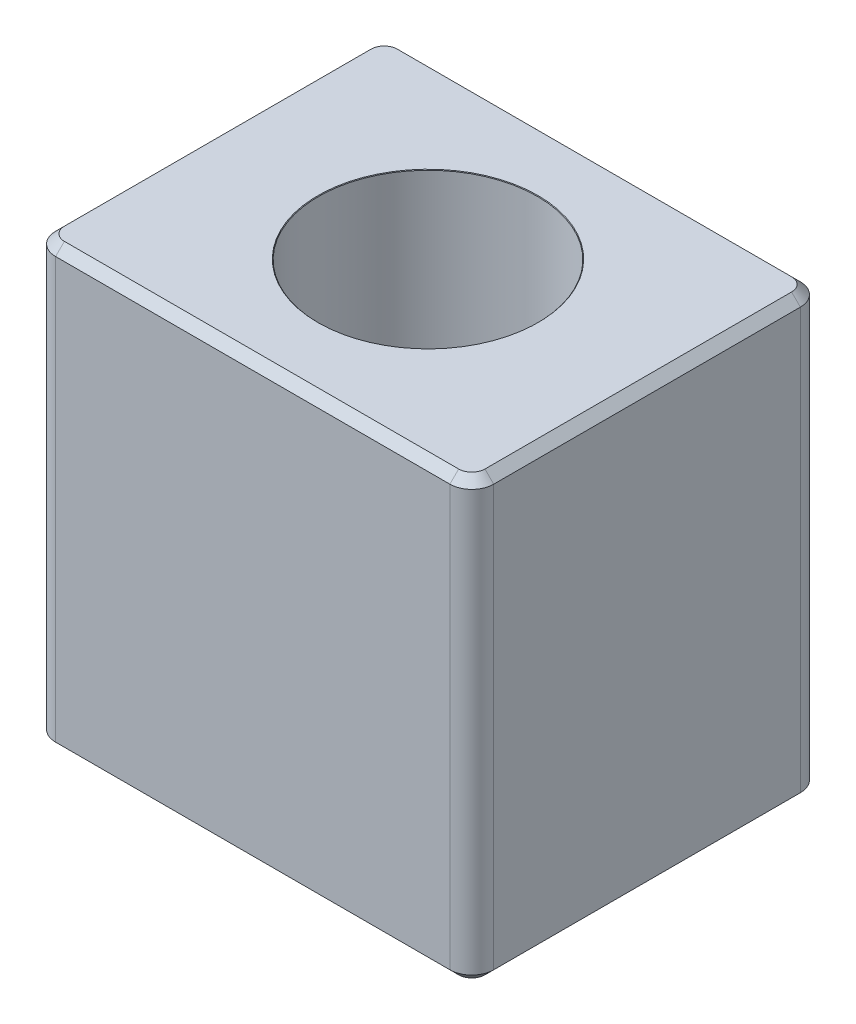
ISO-10303-21;
HEADER;
FILE_DESCRIPTION(('STEP AP214'),'2;1');
FILE_NAME('part.step','',(''),(''),'','','');
FILE_SCHEMA(('AUTOMOTIVE_DESIGN { 1 0 10303 214 1 1 1 1 }'));
ENDSEC;
DATA;
#1=APPLICATION_CONTEXT('core data for automotive mechanical design processes');
#2=APPLICATION_PROTOCOL_DEFINITION('international standard','automotive_design',2000,#1);
#3=PRODUCT_CONTEXT('',#1,'mechanical');
#4=PRODUCT('Part','Part','',(#3));
#5=PRODUCT_RELATED_PRODUCT_CATEGORY('part','',(#4));
#6=PRODUCT_DEFINITION_FORMATION('','',#4);
#7=PRODUCT_DEFINITION_CONTEXT('part definition',#1,'design');
#8=PRODUCT_DEFINITION('design','',#6,#7);
#9=PRODUCT_DEFINITION_SHAPE('','',#8);
#10=(LENGTH_UNIT() NAMED_UNIT(*) SI_UNIT(.MILLI.,.METRE.));
#11=(NAMED_UNIT(*) PLANE_ANGLE_UNIT() SI_UNIT($,.RADIAN.));
#12=(NAMED_UNIT(*) SI_UNIT($,.STERADIAN.) SOLID_ANGLE_UNIT());
#13=UNCERTAINTY_MEASURE_WITH_UNIT(LENGTH_MEASURE(1.E-05),#10,'distance_accuracy_value','');
#14=(GEOMETRIC_REPRESENTATION_CONTEXT(3) GLOBAL_UNCERTAINTY_ASSIGNED_CONTEXT((#13)) GLOBAL_UNIT_ASSIGNED_CONTEXT((#10,
#11,#12)) REPRESENTATION_CONTEXT('',''));
#15=CARTESIAN_POINT('',(0.,0.,0.));
#16=DIRECTION('',(0.,0.,1.));
#17=DIRECTION('',(1.,0.,0.));
#18=AXIS2_PLACEMENT_3D('',#15,#16,#17);
#19=CARTESIAN_POINT('',(-10.,-10.,16.));
#20=DIRECTION('',(1.,0.,0.));
#21=DIRECTION('',(0.,0.,-1.));
#22=AXIS2_PLACEMENT_3D('',#19,#20,#21);
#23=PLANE('',#22);
#24=DIRECTION('',(0.,-1.,0.));
#25=VECTOR('',#24,1.);
#26=CARTESIAN_POINT('',(-10.,10.,15.));
#27=LINE('',#26,#25);
#28=CARTESIAN_POINT('',(-10.,-9.60000000000001,15.));
#29=VERTEX_POINT('',#28);
#30=CARTESIAN_POINT('',(-10.,9.6,15.));
#31=VERTEX_POINT('',#30);
#32=EDGE_CURVE('E309',#29,#31,#27,.F.);
#33=ORIENTED_EDGE('',*,*,#32,.T.);
#34=DIRECTION('',(0.,0.,-1.));
#35=VECTOR('',#34,1.);
#36=CARTESIAN_POINT('',(-10.,9.6,16.));
#37=LINE('',#36,#35);
#38=CARTESIAN_POINT('',(-10.,9.6,1.));
#39=VERTEX_POINT('',#38);
#40=EDGE_CURVE('E198',#31,#39,#37,.T.);
#41=ORIENTED_EDGE('',*,*,#40,.T.);
#42=DIRECTION('',(0.,-1.,0.));
#43=VECTOR('',#42,1.);
#44=CARTESIAN_POINT('',(-10.,-10.,1.));
#45=LINE('',#44,#43);
#46=CARTESIAN_POINT('',(-10.,-9.60000000000001,1.));
#47=VERTEX_POINT('',#46);
#48=EDGE_CURVE('E173',#39,#47,#45,.T.);
#49=ORIENTED_EDGE('',*,*,#48,.T.);
#50=DIRECTION('',(0.,0.,1.));
#51=VECTOR('',#50,1.);
#52=CARTESIAN_POINT('',(-10.,-9.60000000000001,16.));
#53=LINE('',#52,#51);
#54=EDGE_CURVE('E196',#47,#29,#53,.T.);
#55=ORIENTED_EDGE('',*,*,#54,.T.);
#56=EDGE_LOOP('',(#33,#41,#49,#55));
#57=FACE_BOUND('',#56,.T.);
#58=ADVANCED_FACE('F39',(#57),#23,.F.);
#59=CARTESIAN_POINT('',(10.,-10.,16.));
#60=DIRECTION('',(0.,1.,0.));
#61=DIRECTION('',(-1.,0.,0.));
#62=AXIS2_PLACEMENT_3D('',#59,#60,#61);
#63=PLANE('',#62);
#64=DIRECTION('',(0.,0.,-1.));
#65=VECTOR('',#64,1.);
#66=CARTESIAN_POINT('',(-9.6,-10.,16.));
#67=LINE('',#66,#65);
#68=CARTESIAN_POINT('',(-9.6,-10.,15.));
#69=VERTEX_POINT('',#68);
#70=CARTESIAN_POINT('',(-9.6,-10.,1.));
#71=VERTEX_POINT('',#70);
#72=EDGE_CURVE('E49',#69,#71,#67,.T.);
#73=ORIENTED_EDGE('',*,*,#72,.T.);
#74=CARTESIAN_POINT('',(-9.,-10.,1.));
#75=DIRECTION('',(0.,1.,0.));
#76=DIRECTION('',(-1.,0.,0.));
#77=AXIS2_PLACEMENT_3D('',#74,#75,#76);
#78=CIRCLE('',#77,0.600000000000006);
#79=CARTESIAN_POINT('',(-9.,-10.,0.399999999999994));
#80=VERTEX_POINT('',#79);
#81=EDGE_CURVE('E11',#71,#80,#78,.F.);
#82=ORIENTED_EDGE('',*,*,#81,.T.);
#83=DIRECTION('',(1.,0.,0.));
#84=VECTOR('',#83,1.);
#85=CARTESIAN_POINT('',(10.,-10.,0.399999999999994));
#86=LINE('',#85,#84);
#87=CARTESIAN_POINT('',(9.,-10.,0.399999999999994));
#88=VERTEX_POINT('',#87);
#89=EDGE_CURVE('E217',#80,#88,#86,.T.);
#90=ORIENTED_EDGE('',*,*,#89,.T.);
#91=CARTESIAN_POINT('',(9.,-10.,1.));
#92=DIRECTION('',(0.,1.,0.));
#93=DIRECTION('',(-1.,0.,0.));
#94=AXIS2_PLACEMENT_3D('',#91,#92,#93);
#95=CIRCLE('',#94,0.600000000000007);
#96=CARTESIAN_POINT('',(9.60000000000001,-10.,1.));
#97=VERTEX_POINT('',#96);
#98=EDGE_CURVE('E219',#88,#97,#95,.F.);
#99=ORIENTED_EDGE('',*,*,#98,.T.);
#100=DIRECTION('',(0.,0.,1.));
#101=VECTOR('',#100,1.);
#102=CARTESIAN_POINT('',(9.60000000000001,-10.,16.));
#103=LINE('',#102,#101);
#104=CARTESIAN_POINT('',(9.60000000000001,-10.,15.));
#105=VERTEX_POINT('',#104);
#106=EDGE_CURVE('E221',#97,#105,#103,.T.);
#107=ORIENTED_EDGE('',*,*,#106,.T.);
#108=CARTESIAN_POINT('',(9.,-10.,15.));
#109=DIRECTION('',(0.,1.,0.));
#110=DIRECTION('',(-1.,0.,0.));
#111=AXIS2_PLACEMENT_3D('',#108,#109,#110);
#112=CIRCLE('',#111,0.600000000000007);
#113=CARTESIAN_POINT('',(9.,-10.,15.6));
#114=VERTEX_POINT('',#113);
#115=EDGE_CURVE('E223',#105,#114,#112,.F.);
#116=ORIENTED_EDGE('',*,*,#115,.T.);
#117=DIRECTION('',(-1.,0.,0.));
#118=VECTOR('',#117,1.);
#119=CARTESIAN_POINT('',(-9.,-10.,15.6));
#120=LINE('',#119,#118);
#121=CARTESIAN_POINT('',(-9.,-10.,15.6));
#122=VERTEX_POINT('',#121);
#123=EDGE_CURVE('E225',#114,#122,#120,.T.);
#124=ORIENTED_EDGE('',*,*,#123,.T.);
#125=CARTESIAN_POINT('',(-9.,-10.,15.));
#126=DIRECTION('',(0.,1.,0.));
#127=DIRECTION('',(-1.,0.,0.));
#128=AXIS2_PLACEMENT_3D('',#125,#126,#127);
#129=CIRCLE('',#128,0.600000000000007);
#130=EDGE_CURVE('E60',#122,#69,#129,.F.);
#131=ORIENTED_EDGE('',*,*,#130,.T.);
#132=EDGE_LOOP('',(#73,#82,#90,#99,#107,#116,#124,#131));
#133=FACE_BOUND('',#132,.T.);
#134=CARTESIAN_POINT('',(0.,-10.,8.));
#135=DIRECTION('',(0.,1.,0.));
#136=DIRECTION('',(-1.,0.,0.));
#137=AXIS2_PLACEMENT_3D('',#134,#135,#136);
#138=CIRCLE('',#137,2.75);
#139=CARTESIAN_POINT('',(-2.75,-10.,8.));
#140=VERTEX_POINT('',#139);
#141=EDGE_CURVE('E291',#140,#140,#138,.T.);
#142=ORIENTED_EDGE('',*,*,#141,.T.);
#143=EDGE_LOOP('',(#142));
#144=FACE_BOUND('',#143,.T.);
#145=ADVANCED_FACE('F348',(#133,#144),#63,.F.);
#146=CARTESIAN_POINT('',(10.,-10.,16.));
#147=DIRECTION('',(-1.,0.,0.));
#148=DIRECTION('',(0.,0.,1.));
#149=AXIS2_PLACEMENT_3D('',#146,#147,#148);
#150=PLANE('',#149);
#151=DIRECTION('',(0.,1.,0.));
#152=VECTOR('',#151,1.);
#153=CARTESIAN_POINT('',(10.,-10.,1.));
#154=LINE('',#153,#152);
#155=CARTESIAN_POINT('',(10.,-9.60000000000001,1.));
#156=VERTEX_POINT('',#155);
#157=CARTESIAN_POINT('',(10.,9.6,1.));
#158=VERTEX_POINT('',#157);
#159=EDGE_CURVE('E290',#156,#158,#154,.T.);
#160=ORIENTED_EDGE('',*,*,#159,.T.);
#161=DIRECTION('',(0.,0.,1.));
#162=VECTOR('',#161,1.);
#163=CARTESIAN_POINT('',(10.,9.6,16.));
#164=LINE('',#163,#162);
#165=CARTESIAN_POINT('',(10.,9.6,15.));
#166=VERTEX_POINT('',#165);
#167=EDGE_CURVE('E215',#158,#166,#164,.T.);
#168=ORIENTED_EDGE('',*,*,#167,.T.);
#169=DIRECTION('',(0.,1.,0.));
#170=VECTOR('',#169,1.);
#171=CARTESIAN_POINT('',(10.,-10.,15.));
#172=LINE('',#171,#170);
#173=CARTESIAN_POINT('',(10.,-9.60000000000001,15.));
#174=VERTEX_POINT('',#173);
#175=EDGE_CURVE('E283',#166,#174,#172,.F.);
#176=ORIENTED_EDGE('',*,*,#175,.T.);
#177=DIRECTION('',(0.,0.,-1.));
#178=VECTOR('',#177,1.);
#179=CARTESIAN_POINT('',(10.,-9.60000000000001,16.));
#180=LINE('',#179,#178);
#181=EDGE_CURVE('E213',#174,#156,#180,.T.);
#182=ORIENTED_EDGE('',*,*,#181,.T.);
#183=EDGE_LOOP('',(#160,#168,#176,#182));
#184=FACE_BOUND('',#183,.T.);
#185=ADVANCED_FACE('F288',(#184),#150,.F.);
#186=CARTESIAN_POINT('',(10.,10.,16.));
#187=DIRECTION('',(0.,-1.,0.));
#188=DIRECTION('',(0.,0.,-1.));
#189=AXIS2_PLACEMENT_3D('',#186,#187,#188);
#190=PLANE('',#189);
#191=DIRECTION('',(1.,0.,0.));
#192=VECTOR('',#191,1.);
#193=CARTESIAN_POINT('',(9.,10.,15.6));
#194=LINE('',#193,#192);
#195=CARTESIAN_POINT('',(-9.,10.,15.6));
#196=VERTEX_POINT('',#195);
#197=CARTESIAN_POINT('',(9.,10.,15.6));
#198=VERTEX_POINT('',#197);
#199=EDGE_CURVE('E178',#196,#198,#194,.T.);
#200=ORIENTED_EDGE('',*,*,#199,.T.);
#201=CARTESIAN_POINT('',(9.,10.,15.));
#202=DIRECTION('',(0.,-1.,0.));
#203=DIRECTION('',(0.,0.,-1.));
#204=AXIS2_PLACEMENT_3D('',#201,#202,#203);
#205=CIRCLE('',#204,0.600000000000003);
#206=CARTESIAN_POINT('',(9.6,10.,15.));
#207=VERTEX_POINT('',#206);
#208=EDGE_CURVE('E158',#198,#207,#205,.F.);
#209=ORIENTED_EDGE('',*,*,#208,.T.);
#210=DIRECTION('',(0.,0.,-1.));
#211=VECTOR('',#210,1.);
#212=CARTESIAN_POINT('',(9.6,10.,16.));
#213=LINE('',#212,#211);
#214=CARTESIAN_POINT('',(9.6,10.,1.));
#215=VERTEX_POINT('',#214);
#216=EDGE_CURVE('E166',#207,#215,#213,.T.);
#217=ORIENTED_EDGE('',*,*,#216,.T.);
#218=CARTESIAN_POINT('',(9.,10.,1.));
#219=DIRECTION('',(0.,-1.,0.));
#220=DIRECTION('',(0.,0.,-1.));
#221=AXIS2_PLACEMENT_3D('',#218,#219,#220);
#222=CIRCLE('',#221,0.600000000000001);
#223=CARTESIAN_POINT('',(9.,10.,0.4));
#224=VERTEX_POINT('',#223);
#225=EDGE_CURVE('E172',#215,#224,#222,.F.);
#226=ORIENTED_EDGE('',*,*,#225,.T.);
#227=DIRECTION('',(-1.,0.,0.));
#228=VECTOR('',#227,1.);
#229=CARTESIAN_POINT('',(10.,10.,0.399999999999998));
#230=LINE('',#229,#228);
#231=CARTESIAN_POINT('',(-9.,10.,0.399999999999998));
#232=VERTEX_POINT('',#231);
#233=EDGE_CURVE('E315',#224,#232,#230,.T.);
#234=ORIENTED_EDGE('',*,*,#233,.T.);
#235=CARTESIAN_POINT('',(-9.,10.,1.));
#236=DIRECTION('',(0.,-1.,0.));
#237=DIRECTION('',(0.,0.,-1.));
#238=AXIS2_PLACEMENT_3D('',#235,#236,#237);
#239=CIRCLE('',#238,0.600000000000003);
#240=CARTESIAN_POINT('',(-9.6,10.,1.));
#241=VERTEX_POINT('',#240);
#242=EDGE_CURVE('E317',#232,#241,#239,.F.);
#243=ORIENTED_EDGE('',*,*,#242,.T.);
#244=DIRECTION('',(0.,0.,1.));
#245=VECTOR('',#244,1.);
#246=CARTESIAN_POINT('',(-9.6,10.,16.));
#247=LINE('',#246,#245);
#248=CARTESIAN_POINT('',(-9.6,10.,15.));
#249=VERTEX_POINT('',#248);
#250=EDGE_CURVE('E319',#241,#249,#247,.T.);
#251=ORIENTED_EDGE('',*,*,#250,.T.);
#252=CARTESIAN_POINT('',(-9.,10.,15.));
#253=DIRECTION('',(0.,-1.,0.));
#254=DIRECTION('',(0.,0.,-1.));
#255=AXIS2_PLACEMENT_3D('',#252,#253,#254);
#256=CIRCLE('',#255,0.600000000000003);
#257=EDGE_CURVE('E183',#249,#196,#256,.F.);
#258=ORIENTED_EDGE('',*,*,#257,.T.);
#259=EDGE_LOOP('',(#200,#209,#217,#226,#234,#243,#251,#258));
#260=FACE_BOUND('',#259,.T.);
#261=CARTESIAN_POINT('',(0.,10.,8.));
#262=DIRECTION('',(0.,1.,0.));
#263=DIRECTION('',(0.,0.,1.));
#264=AXIS2_PLACEMENT_3D('',#261,#262,#263);
#265=CIRCLE('',#264,5.025);
#266=CARTESIAN_POINT('',(0.,10.,13.025));
#267=VERTEX_POINT('',#266);
#268=EDGE_CURVE('E246',#267,#267,#265,.T.);
#269=ORIENTED_EDGE('',*,*,#268,.F.);
#270=EDGE_LOOP('',(#269));
#271=FACE_BOUND('',#270,.T.);
#272=ADVANCED_FACE('F175',(#260,#271),#190,.F.);
#273=CARTESIAN_POINT('',(0.,0.,16.));
#274=DIRECTION('',(0.,0.,1.));
#275=DIRECTION('',(1.,0.,0.));
#276=AXIS2_PLACEMENT_3D('',#273,#274,#275);
#277=PLANE('',#276);
#278=DIRECTION('',(0.,1.,0.));
#279=VECTOR('',#278,1.);
#280=CARTESIAN_POINT('',(9.,10.,16.));
#281=LINE('',#280,#279);
#282=CARTESIAN_POINT('',(9.,-9.60000000000001,16.));
#283=VERTEX_POINT('',#282);
#284=CARTESIAN_POINT('',(9.,9.6,16.));
#285=VERTEX_POINT('',#284);
#286=EDGE_CURVE('E285',#283,#285,#281,.T.);
#287=ORIENTED_EDGE('',*,*,#286,.T.);
#288=DIRECTION('',(-1.,0.,0.));
#289=VECTOR('',#288,1.);
#290=CARTESIAN_POINT('',(-9.,9.6,16.));
#291=LINE('',#290,#289);
#292=CARTESIAN_POINT('',(-9.,9.6,16.));
#293=VERTEX_POINT('',#292);
#294=EDGE_CURVE('E190',#285,#293,#291,.T.);
#295=ORIENTED_EDGE('',*,*,#294,.T.);
#296=DIRECTION('',(0.,-1.,0.));
#297=VECTOR('',#296,1.);
#298=CARTESIAN_POINT('',(-9.,-10.,16.));
#299=LINE('',#298,#297);
#300=CARTESIAN_POINT('',(-9.,-9.60000000000001,16.));
#301=VERTEX_POINT('',#300);
#302=EDGE_CURVE('E305',#293,#301,#299,.T.);
#303=ORIENTED_EDGE('',*,*,#302,.T.);
#304=DIRECTION('',(1.,0.,0.));
#305=VECTOR('',#304,1.);
#306=CARTESIAN_POINT('',(9.,-9.60000000000001,16.));
#307=LINE('',#306,#305);
#308=EDGE_CURVE('E188',#301,#283,#307,.T.);
#309=ORIENTED_EDGE('',*,*,#308,.T.);
#310=EDGE_LOOP('',(#287,#295,#303,#309));
#311=FACE_BOUND('',#310,.T.);
#312=ADVANCED_FACE('F332',(#311),#277,.T.);
#313=CARTESIAN_POINT('',(0.,0.,0.));
#314=DIRECTION('',(0.,0.,1.));
#315=DIRECTION('',(1.,0.,0.));
#316=AXIS2_PLACEMENT_3D('',#313,#314,#315);
#317=PLANE('',#316);
#318=DIRECTION('',(0.,-1.,0.));
#319=VECTOR('',#318,1.);
#320=CARTESIAN_POINT('',(-9.,0.,0.));
#321=LINE('',#320,#319);
#322=CARTESIAN_POINT('',(-9.,-9.60000000000001,0.));
#323=VERTEX_POINT('',#322);
#324=CARTESIAN_POINT('',(-9.,9.6,0.));
#325=VERTEX_POINT('',#324);
#326=EDGE_CURVE('E293',#323,#325,#321,.F.);
#327=ORIENTED_EDGE('',*,*,#326,.T.);
#328=DIRECTION('',(1.,0.,0.));
#329=VECTOR('',#328,1.);
#330=CARTESIAN_POINT('',(0.,9.6,0.));
#331=LINE('',#330,#329);
#332=CARTESIAN_POINT('',(9.,9.6,0.));
#333=VERTEX_POINT('',#332);
#334=EDGE_CURVE('E207',#325,#333,#331,.T.);
#335=ORIENTED_EDGE('',*,*,#334,.T.);
#336=DIRECTION('',(0.,1.,0.));
#337=VECTOR('',#336,1.);
#338=CARTESIAN_POINT('',(9.,0.,0.));
#339=LINE('',#338,#337);
#340=CARTESIAN_POINT('',(9.,-9.60000000000001,0.));
#341=VERTEX_POINT('',#340);
#342=EDGE_CURVE('E302',#333,#341,#339,.F.);
#343=ORIENTED_EDGE('',*,*,#342,.T.);
#344=DIRECTION('',(-1.,0.,0.));
#345=VECTOR('',#344,1.);
#346=CARTESIAN_POINT('',(0.,-9.60000000000001,0.));
#347=LINE('',#346,#345);
#348=EDGE_CURVE('E205',#341,#323,#347,.T.);
#349=ORIENTED_EDGE('',*,*,#348,.T.);
#350=EDGE_LOOP('',(#327,#335,#343,#349));
#351=FACE_BOUND('',#350,.T.);
#352=ADVANCED_FACE('F361',(#351),#317,.F.);
#353=CARTESIAN_POINT('',(0.,10.,8.));
#354=DIRECTION('',(0.,1.,0.));
#355=DIRECTION('',(0.,0.,1.));
#356=AXIS2_PLACEMENT_3D('',#353,#354,#355);
#357=CYLINDRICAL_SURFACE('',#356,2.75);
#358=ORIENTED_EDGE('',*,*,#141,.F.);
#359=EDGE_LOOP('',(#358));
#360=FACE_BOUND('',#359,.T.);
#361=CARTESIAN_POINT('',(0.,-1.,8.));
#362=DIRECTION('',(0.,1.,0.));
#363=DIRECTION('',(0.,0.,1.));
#364=AXIS2_PLACEMENT_3D('',#361,#362,#363);
#365=CIRCLE('',#364,2.75);
#366=CARTESIAN_POINT('',(0.,-1.,10.75));
#367=VERTEX_POINT('',#366);
#368=EDGE_CURVE('E296',#367,#367,#365,.T.);
#369=ORIENTED_EDGE('',*,*,#368,.T.);
#370=EDGE_LOOP('',(#369));
#371=FACE_BOUND('',#370,.T.);
#372=ADVANCED_FACE('F550',(#360,#371),#357,.F.);
#373=CARTESIAN_POINT('',(5.,-1.,8.));
#374=DIRECTION('',(0.,-1.,0.));
#375=DIRECTION('',(0.,0.,-1.));
#376=AXIS2_PLACEMENT_3D('',#373,#374,#375);
#377=PLANE('',#376);
#378=ORIENTED_EDGE('',*,*,#368,.F.);
#379=EDGE_LOOP('',(#378));
#380=FACE_BOUND('',#379,.T.);
#381=CARTESIAN_POINT('',(0.,-1.,8.));
#382=DIRECTION('',(0.,1.,0.));
#383=DIRECTION('',(0.,0.,1.));
#384=AXIS2_PLACEMENT_3D('',#381,#382,#383);
#385=CIRCLE('',#384,5.);
#386=CARTESIAN_POINT('',(0.,-1.,13.));
#387=VERTEX_POINT('',#386);
#388=EDGE_CURVE('E739',#387,#387,#385,.T.);
#389=ORIENTED_EDGE('',*,*,#388,.T.);
#390=EDGE_LOOP('',(#389));
#391=FACE_BOUND('',#390,.T.);
#392=ADVANCED_FACE('F542',(#380,#391),#377,.F.);
#393=CARTESIAN_POINT('',(0.,10.,8.));
#394=DIRECTION('',(0.,1.,0.));
#395=DIRECTION('',(0.,0.,1.));
#396=AXIS2_PLACEMENT_3D('',#393,#394,#395);
#397=CYLINDRICAL_SURFACE('',#396,5.);
#398=ORIENTED_EDGE('',*,*,#388,.F.);
#399=EDGE_LOOP('',(#398));
#400=FACE_BOUND('',#399,.T.);
#401=CARTESIAN_POINT('',(0.,9.97499999999999,8.));
#402=DIRECTION('',(0.,1.,0.));
#403=DIRECTION('',(0.,0.,1.));
#404=AXIS2_PLACEMENT_3D('',#401,#402,#403);
#405=CIRCLE('',#404,5.);
#406=CARTESIAN_POINT('',(0.,9.97499999999999,13.));
#407=VERTEX_POINT('',#406);
#408=EDGE_CURVE('E741',#407,#407,#405,.T.);
#409=ORIENTED_EDGE('',*,*,#408,.T.);
#410=EDGE_LOOP('',(#409));
#411=FACE_BOUND('',#410,.T.);
#412=ADVANCED_FACE('F534',(#400,#411),#397,.F.);
#413=CARTESIAN_POINT('',(0.,10.,8.));
#414=DIRECTION('',(0.,1.,0.));
#415=DIRECTION('',(0.,0.,1.));
#416=AXIS2_PLACEMENT_3D('',#413,#414,#415);
#417=CONICAL_SURFACE('',#416,5.025,0.785398163397396);
#418=ORIENTED_EDGE('',*,*,#408,.F.);
#419=EDGE_LOOP('',(#418));
#420=FACE_BOUND('',#419,.T.);
#421=ORIENTED_EDGE('',*,*,#268,.T.);
#422=EDGE_LOOP('',(#421));
#423=FACE_BOUND('',#422,.T.);
#424=ADVANCED_FACE('F388',(#420,#423),#417,.F.);
#425=CARTESIAN_POINT('',(9.,-10.,1.));
#426=DIRECTION('',(0.,1.,0.));
#427=DIRECTION('',(0.,0.,1.));
#428=AXIS2_PLACEMENT_3D('',#425,#426,#427);
#429=CYLINDRICAL_SURFACE('',#428,1.);
#430=ORIENTED_EDGE('',*,*,#342,.F.);
#431=CARTESIAN_POINT('',(9.,9.6,1.));
#432=DIRECTION('',(0.,-1.,0.));
#433=DIRECTION('',(0.,0.,-1.));
#434=AXIS2_PLACEMENT_3D('',#431,#432,#433);
#435=CIRCLE('',#434,1.);
#436=EDGE_CURVE('E211',#333,#158,#435,.T.);
#437=ORIENTED_EDGE('',*,*,#436,.T.);
#438=ORIENTED_EDGE('',*,*,#159,.F.);
#439=CARTESIAN_POINT('',(9.,-9.60000000000001,1.));
#440=DIRECTION('',(0.,1.,0.));
#441=DIRECTION('',(0.,0.,1.));
#442=AXIS2_PLACEMENT_3D('',#439,#440,#441);
#443=CIRCLE('',#442,1.);
#444=EDGE_CURVE('E209',#156,#341,#443,.T.);
#445=ORIENTED_EDGE('',*,*,#444,.T.);
#446=EDGE_LOOP('',(#430,#437,#438,#445));
#447=FACE_BOUND('',#446,.T.);
#448=ADVANCED_FACE('F385',(#447),#429,.T.);
#449=CARTESIAN_POINT('',(9.,0.,15.));
#450=DIRECTION('',(0.,-1.,0.));
#451=DIRECTION('',(0.,0.,-1.));
#452=AXIS2_PLACEMENT_3D('',#449,#450,#451);
#453=CYLINDRICAL_SURFACE('',#452,1.);
#454=ORIENTED_EDGE('',*,*,#175,.F.);
#455=CARTESIAN_POINT('',(9.,9.6,15.));
#456=DIRECTION('',(0.,-1.,0.));
#457=DIRECTION('',(0.,0.,-1.));
#458=AXIS2_PLACEMENT_3D('',#455,#456,#457);
#459=CIRCLE('',#458,1.);
#460=EDGE_CURVE('E160',#166,#285,#459,.T.);
#461=ORIENTED_EDGE('',*,*,#460,.T.);
#462=ORIENTED_EDGE('',*,*,#286,.F.);
#463=CARTESIAN_POINT('',(9.,-9.60000000000001,15.));
#464=DIRECTION('',(0.,1.,0.));
#465=DIRECTION('',(0.,0.,1.));
#466=AXIS2_PLACEMENT_3D('',#463,#464,#465);
#467=CIRCLE('',#466,1.);
#468=EDGE_CURVE('E180',#283,#174,#467,.T.);
#469=ORIENTED_EDGE('',*,*,#468,.T.);
#470=EDGE_LOOP('',(#454,#461,#462,#469));
#471=FACE_BOUND('',#470,.T.);
#472=ADVANCED_FACE('F282',(#471),#453,.T.);
#473=CARTESIAN_POINT('',(-9.,-10.,1.));
#474=DIRECTION('',(0.,-1.,0.));
#475=DIRECTION('',(0.,0.,-1.));
#476=AXIS2_PLACEMENT_3D('',#473,#474,#475);
#477=CYLINDRICAL_SURFACE('',#476,1.);
#478=ORIENTED_EDGE('',*,*,#48,.F.);
#479=CARTESIAN_POINT('',(-9.,9.6,1.));
#480=DIRECTION('',(0.,-1.,0.));
#481=DIRECTION('',(0.,0.,-1.));
#482=AXIS2_PLACEMENT_3D('',#479,#480,#481);
#483=CIRCLE('',#482,1.);
#484=EDGE_CURVE('E203',#39,#325,#483,.T.);
#485=ORIENTED_EDGE('',*,*,#484,.T.);
#486=ORIENTED_EDGE('',*,*,#326,.F.);
#487=CARTESIAN_POINT('',(-9.,-9.60000000000001,1.));
#488=DIRECTION('',(0.,1.,0.));
#489=DIRECTION('',(0.,0.,1.));
#490=AXIS2_PLACEMENT_3D('',#487,#488,#489);
#491=CIRCLE('',#490,1.);
#492=EDGE_CURVE('E200',#323,#47,#491,.T.);
#493=ORIENTED_EDGE('',*,*,#492,.T.);
#494=EDGE_LOOP('',(#478,#485,#486,#493));
#495=FACE_BOUND('',#494,.T.);
#496=ADVANCED_FACE('F366',(#495),#477,.T.);
#497=CARTESIAN_POINT('',(-9.,0.,15.));
#498=DIRECTION('',(0.,1.,0.));
#499=DIRECTION('',(0.,0.,1.));
#500=AXIS2_PLACEMENT_3D('',#497,#498,#499);
#501=CYLINDRICAL_SURFACE('',#500,1.);
#502=ORIENTED_EDGE('',*,*,#302,.F.);
#503=CARTESIAN_POINT('',(-9.,9.6,15.));
#504=DIRECTION('',(0.,-1.,0.));
#505=DIRECTION('',(0.,0.,-1.));
#506=AXIS2_PLACEMENT_3D('',#503,#504,#505);
#507=CIRCLE('',#506,1.);
#508=EDGE_CURVE('E194',#293,#31,#507,.T.);
#509=ORIENTED_EDGE('',*,*,#508,.T.);
#510=ORIENTED_EDGE('',*,*,#32,.F.);
#511=CARTESIAN_POINT('',(-9.,-9.60000000000001,15.));
#512=DIRECTION('',(0.,1.,0.));
#513=DIRECTION('',(0.,0.,1.));
#514=AXIS2_PLACEMENT_3D('',#511,#512,#513);
#515=CIRCLE('',#514,1.);
#516=EDGE_CURVE('E192',#29,#301,#515,.T.);
#517=ORIENTED_EDGE('',*,*,#516,.T.);
#518=EDGE_LOOP('',(#502,#509,#510,#517));
#519=FACE_BOUND('',#518,.T.);
#520=ADVANCED_FACE('F334',(#519),#501,.T.);
#521=CARTESIAN_POINT('',(-9.,10.,1.));
#522=DIRECTION('',(0.,-1.,0.));
#523=DIRECTION('',(0.,0.,-1.));
#524=AXIS2_PLACEMENT_3D('',#521,#522,#523);
#525=CONICAL_SURFACE('',#524,0.600000000000003,0.785398163397443);
#526=DIRECTION('',(0.,0.707106781186551,0.707106781186544));
#527=VECTOR('',#526,1.);
#528=CARTESIAN_POINT('',(-9.,9.6,0.));
#529=LINE('',#528,#527);
#530=EDGE_CURVE('E240',#325,#232,#529,.T.);
#531=ORIENTED_EDGE('',*,*,#530,.F.);
#532=ORIENTED_EDGE('',*,*,#484,.F.);
#533=DIRECTION('',(-0.707106781186544,-0.707106781186551,0.));
#534=VECTOR('',#533,1.);
#535=CARTESIAN_POINT('',(-9.6,10.,1.));
#536=LINE('',#535,#534);
#537=EDGE_CURVE('E243',#241,#39,#536,.T.);
#538=ORIENTED_EDGE('',*,*,#537,.F.);
#539=ORIENTED_EDGE('',*,*,#242,.F.);
#540=EDGE_LOOP('',(#531,#532,#538,#539));
#541=FACE_BOUND('',#540,.T.);
#542=ADVANCED_FACE('F370',(#541),#525,.T.);
#543=CARTESIAN_POINT('',(-10.,9.6,16.));
#544=DIRECTION('',(0.707106781186551,-0.707106781186544,0.));
#545=DIRECTION('',(0.,0.,-1.));
#546=AXIS2_PLACEMENT_3D('',#543,#544,#545);
#547=PLANE('',#546);
#548=ORIENTED_EDGE('',*,*,#537,.T.);
#549=ORIENTED_EDGE('',*,*,#40,.F.);
#550=DIRECTION('',(-0.707106781186544,-0.707106781186551,0.));
#551=VECTOR('',#550,1.);
#552=CARTESIAN_POINT('',(-9.6,10.,15.));
#553=LINE('',#552,#551);
#554=EDGE_CURVE('E237',#249,#31,#553,.T.);
#555=ORIENTED_EDGE('',*,*,#554,.F.);
#556=ORIENTED_EDGE('',*,*,#250,.F.);
#557=EDGE_LOOP('',(#548,#549,#555,#556));
#558=FACE_BOUND('',#557,.T.);
#559=ADVANCED_FACE('F375',(#558),#547,.F.);
#560=CARTESIAN_POINT('',(10.,10.,0.399999999999998));
#561=DIRECTION('',(0.,-0.707106781186544,0.707106781186551));
#562=DIRECTION('',(-1.,0.,0.));
#563=AXIS2_PLACEMENT_3D('',#560,#561,#562);
#564=PLANE('',#563);
#565=ORIENTED_EDGE('',*,*,#530,.T.);
#566=ORIENTED_EDGE('',*,*,#233,.F.);
#567=DIRECTION('',(0.,0.707106781186551,0.707106781186544));
#568=VECTOR('',#567,1.);
#569=CARTESIAN_POINT('',(9.,9.6,0.));
#570=LINE('',#569,#568);
#571=EDGE_CURVE('E234',#333,#224,#570,.T.);
#572=ORIENTED_EDGE('',*,*,#571,.F.);
#573=ORIENTED_EDGE('',*,*,#334,.F.);
#574=EDGE_LOOP('',(#565,#566,#572,#573));
#575=FACE_BOUND('',#574,.T.);
#576=ADVANCED_FACE('F424',(#575),#564,.F.);
#577=CARTESIAN_POINT('',(-9.,10.,15.));
#578=DIRECTION('',(0.,-1.,0.));
#579=DIRECTION('',(0.,0.,-1.));
#580=AXIS2_PLACEMENT_3D('',#577,#578,#579);
#581=CONICAL_SURFACE('',#580,0.600000000000003,0.785398163397443);
#582=ORIENTED_EDGE('',*,*,#554,.T.);
#583=ORIENTED_EDGE('',*,*,#508,.F.);
#584=DIRECTION('',(0.,-0.707106781186551,0.707106781186544));
#585=VECTOR('',#584,1.);
#586=CARTESIAN_POINT('',(-9.,10.,15.6));
#587=LINE('',#586,#585);
#588=EDGE_CURVE('E231',#196,#293,#587,.T.);
#589=ORIENTED_EDGE('',*,*,#588,.F.);
#590=ORIENTED_EDGE('',*,*,#257,.F.);
#591=EDGE_LOOP('',(#582,#583,#589,#590));
#592=FACE_BOUND('',#591,.T.);
#593=ADVANCED_FACE('F326',(#592),#581,.T.);
#594=CARTESIAN_POINT('',(9.,10.,1.));
#595=DIRECTION('',(0.,-1.,0.));
#596=DIRECTION('',(0.,0.,-1.));
#597=AXIS2_PLACEMENT_3D('',#594,#595,#596);
#598=CONICAL_SURFACE('',#597,0.600000000000002,0.785398163397448);
#599=ORIENTED_EDGE('',*,*,#571,.T.);
#600=ORIENTED_EDGE('',*,*,#225,.F.);
#601=DIRECTION('',(-0.707106781186549,0.707106781186546,0.));
#602=VECTOR('',#601,1.);
#603=CARTESIAN_POINT('',(10.,9.6,1.));
#604=LINE('',#603,#602);
#605=EDGE_CURVE('E169',#158,#215,#604,.T.);
#606=ORIENTED_EDGE('',*,*,#605,.F.);
#607=ORIENTED_EDGE('',*,*,#436,.F.);
#608=EDGE_LOOP('',(#599,#600,#606,#607));
#609=FACE_BOUND('',#608,.T.);
#610=ADVANCED_FACE('F412',(#609),#598,.T.);
#611=CARTESIAN_POINT('',(0.,9.6,16.));
#612=DIRECTION('',(0.,0.707106781186544,0.707106781186551));
#613=DIRECTION('',(1.,0.,0.));
#614=AXIS2_PLACEMENT_3D('',#611,#612,#613);
#615=PLANE('',#614);
#616=ORIENTED_EDGE('',*,*,#588,.T.);
#617=ORIENTED_EDGE('',*,*,#294,.F.);
#618=DIRECTION('',(0.,-0.707106781186551,0.707106781186544));
#619=VECTOR('',#618,1.);
#620=CARTESIAN_POINT('',(9.,10.,15.6));
#621=LINE('',#620,#619);
#622=EDGE_CURVE('E163',#198,#285,#621,.T.);
#623=ORIENTED_EDGE('',*,*,#622,.F.);
#624=ORIENTED_EDGE('',*,*,#199,.F.);
#625=EDGE_LOOP('',(#616,#617,#623,#624));
#626=FACE_BOUND('',#625,.T.);
#627=ADVANCED_FACE('F329',(#626),#615,.T.);
#628=CARTESIAN_POINT('',(9.6,10.,16.));
#629=DIRECTION('',(-0.707106781186549,-0.707106781186546,0.));
#630=DIRECTION('',(0.,0.,-1.));
#631=AXIS2_PLACEMENT_3D('',#628,#629,#630);
#632=PLANE('',#631);
#633=ORIENTED_EDGE('',*,*,#605,.T.);
#634=ORIENTED_EDGE('',*,*,#216,.F.);
#635=DIRECTION('',(-0.707106781186546,0.707106781186549,0.));
#636=VECTOR('',#635,1.);
#637=CARTESIAN_POINT('',(10.,9.6,15.));
#638=LINE('',#637,#636);
#639=EDGE_CURVE('E154',#166,#207,#638,.T.);
#640=ORIENTED_EDGE('',*,*,#639,.F.);
#641=ORIENTED_EDGE('',*,*,#167,.F.);
#642=EDGE_LOOP('',(#633,#634,#640,#641));
#643=FACE_BOUND('',#642,.T.);
#644=ADVANCED_FACE('F167',(#643),#632,.F.);
#645=CARTESIAN_POINT('',(9.,10.,15.));
#646=DIRECTION('',(0.,-1.,0.));
#647=DIRECTION('',(0.,0.,-1.));
#648=AXIS2_PLACEMENT_3D('',#645,#646,#647);
#649=CONICAL_SURFACE('',#648,0.600000000000003,0.785398163397443);
#650=ORIENTED_EDGE('',*,*,#622,.T.);
#651=ORIENTED_EDGE('',*,*,#460,.F.);
#652=ORIENTED_EDGE('',*,*,#639,.T.);
#653=ORIENTED_EDGE('',*,*,#208,.F.);
#654=EDGE_LOOP('',(#650,#651,#652,#653));
#655=FACE_BOUND('',#654,.T.);
#656=ADVANCED_FACE('F156',(#655),#649,.T.);
#657=CARTESIAN_POINT('',(9.,-10.,15.));
#658=DIRECTION('',(0.,1.,0.));
#659=DIRECTION('',(0.,0.,1.));
#660=AXIS2_PLACEMENT_3D('',#657,#658,#659);
#661=CONICAL_SURFACE('',#660,0.600000000000007,0.785398163397447);
#662=DIRECTION('',(-0.707106781186548,-0.707106781186548,0.));
#663=VECTOR('',#662,1.);
#664=CARTESIAN_POINT('',(10.,-9.60000000000001,15.));
#665=LINE('',#664,#663);
#666=EDGE_CURVE('E262',#174,#105,#665,.T.);
#667=ORIENTED_EDGE('',*,*,#666,.F.);
#668=ORIENTED_EDGE('',*,*,#468,.F.);
#669=DIRECTION('',(0.,0.707106781186548,0.707106781186548));
#670=VECTOR('',#669,1.);
#671=CARTESIAN_POINT('',(9.,-10.,15.6));
#672=LINE('',#671,#670);
#673=EDGE_CURVE('E44',#114,#283,#672,.T.);
#674=ORIENTED_EDGE('',*,*,#673,.F.);
#675=ORIENTED_EDGE('',*,*,#115,.F.);
#676=EDGE_LOOP('',(#667,#668,#674,#675));
#677=FACE_BOUND('',#676,.T.);
#678=ADVANCED_FACE('F42',(#677),#661,.T.);
#679=CARTESIAN_POINT('',(0.,-9.60000000000001,16.));
#680=DIRECTION('',(0.,-0.707106781186548,0.707106781186547));
#681=DIRECTION('',(-1.,0.,0.));
#682=AXIS2_PLACEMENT_3D('',#679,#680,#681);
#683=PLANE('',#682);
#684=ORIENTED_EDGE('',*,*,#673,.T.);
#685=ORIENTED_EDGE('',*,*,#308,.F.);
#686=DIRECTION('',(0.,0.707106781186546,0.707106781186549));
#687=VECTOR('',#686,1.);
#688=CARTESIAN_POINT('',(-9.,-10.,15.6));
#689=LINE('',#688,#687);
#690=EDGE_CURVE('E260',#122,#301,#689,.T.);
#691=ORIENTED_EDGE('',*,*,#690,.F.);
#692=ORIENTED_EDGE('',*,*,#123,.F.);
#693=EDGE_LOOP('',(#684,#685,#691,#692));
#694=FACE_BOUND('',#693,.T.);
#695=ADVANCED_FACE('F273',(#694),#683,.T.);
#696=CARTESIAN_POINT('',(10.,-9.60000000000001,16.));
#697=DIRECTION('',(-0.707106781186548,0.707106781186548,0.));
#698=DIRECTION('',(0.,0.,-1.));
#699=AXIS2_PLACEMENT_3D('',#696,#697,#698);
#700=PLANE('',#699);
#701=ORIENTED_EDGE('',*,*,#666,.T.);
#702=ORIENTED_EDGE('',*,*,#106,.F.);
#703=DIRECTION('',(-0.707106781186548,-0.707106781186548,0.));
#704=VECTOR('',#703,1.);
#705=CARTESIAN_POINT('',(10.,-9.60000000000001,1.));
#706=LINE('',#705,#704);
#707=EDGE_CURVE('E257',#156,#97,#706,.T.);
#708=ORIENTED_EDGE('',*,*,#707,.F.);
#709=ORIENTED_EDGE('',*,*,#181,.F.);
#710=EDGE_LOOP('',(#701,#702,#708,#709));
#711=FACE_BOUND('',#710,.T.);
#712=ADVANCED_FACE('F466',(#711),#700,.F.);
#713=CARTESIAN_POINT('',(-9.,-10.,15.));
#714=DIRECTION('',(0.,1.,0.));
#715=DIRECTION('',(0.,0.,1.));
#716=AXIS2_PLACEMENT_3D('',#713,#714,#715);
#717=CONICAL_SURFACE('',#716,0.600000000000007,0.785398163397447);
#718=ORIENTED_EDGE('',*,*,#690,.T.);
#719=ORIENTED_EDGE('',*,*,#516,.F.);
#720=DIRECTION('',(-0.707106781186548,0.707106781186548,0.));
#721=VECTOR('',#720,1.);
#722=CARTESIAN_POINT('',(-9.6,-10.,15.));
#723=LINE('',#722,#721);
#724=EDGE_CURVE('E254',#69,#29,#723,.T.);
#725=ORIENTED_EDGE('',*,*,#724,.F.);
#726=ORIENTED_EDGE('',*,*,#130,.F.);
#727=EDGE_LOOP('',(#718,#719,#725,#726));
#728=FACE_BOUND('',#727,.T.);
#729=ADVANCED_FACE('F338',(#728),#717,.T.);
#730=CARTESIAN_POINT('',(9.,-10.,1.));
#731=DIRECTION('',(0.,1.,0.));
#732=DIRECTION('',(0.,0.,1.));
#733=AXIS2_PLACEMENT_3D('',#730,#731,#732);
#734=CONICAL_SURFACE('',#733,0.600000000000007,0.785398163397447);
#735=ORIENTED_EDGE('',*,*,#707,.T.);
#736=ORIENTED_EDGE('',*,*,#98,.F.);
#737=DIRECTION('',(0.,-0.707106781186548,0.707106781186547));
#738=VECTOR('',#737,1.);
#739=CARTESIAN_POINT('',(9.,-9.60000000000001,0.));
#740=LINE('',#739,#738);
#741=EDGE_CURVE('E251',#341,#88,#740,.T.);
#742=ORIENTED_EDGE('',*,*,#741,.F.);
#743=ORIENTED_EDGE('',*,*,#444,.F.);
#744=EDGE_LOOP('',(#735,#736,#742,#743));
#745=FACE_BOUND('',#744,.T.);
#746=ADVANCED_FACE('F354',(#745),#734,.T.);
#747=CARTESIAN_POINT('',(-9.6,-10.,16.));
#748=DIRECTION('',(0.707106781186548,0.707106781186548,0.));
#749=DIRECTION('',(0.,0.,-1.));
#750=AXIS2_PLACEMENT_3D('',#747,#748,#749);
#751=PLANE('',#750);
#752=ORIENTED_EDGE('',*,*,#724,.T.);
#753=ORIENTED_EDGE('',*,*,#54,.F.);
#754=DIRECTION('',(-0.707106781186548,0.707106781186548,0.));
#755=VECTOR('',#754,1.);
#756=CARTESIAN_POINT('',(-9.6,-10.,1.));
#757=LINE('',#756,#755);
#758=EDGE_CURVE('E249',#71,#47,#757,.T.);
#759=ORIENTED_EDGE('',*,*,#758,.F.);
#760=ORIENTED_EDGE('',*,*,#72,.F.);
#761=EDGE_LOOP('',(#752,#753,#759,#760));
#762=FACE_BOUND('',#761,.T.);
#763=ADVANCED_FACE('F341',(#762),#751,.F.);
#764=CARTESIAN_POINT('',(10.,-10.,0.399999999999994));
#765=DIRECTION('',(0.,0.707106781186548,0.707106781186547));
#766=DIRECTION('',(1.,0.,0.));
#767=AXIS2_PLACEMENT_3D('',#764,#765,#766);
#768=PLANE('',#767);
#769=ORIENTED_EDGE('',*,*,#741,.T.);
#770=ORIENTED_EDGE('',*,*,#89,.F.);
#771=DIRECTION('',(0.,-0.707106781186548,0.707106781186548));
#772=VECTOR('',#771,1.);
#773=CARTESIAN_POINT('',(-9.,-9.60000000000001,0.));
#774=LINE('',#773,#772);
#775=EDGE_CURVE('E247',#323,#80,#774,.T.);
#776=ORIENTED_EDGE('',*,*,#775,.F.);
#777=ORIENTED_EDGE('',*,*,#348,.F.);
#778=EDGE_LOOP('',(#769,#770,#776,#777));
#779=FACE_BOUND('',#778,.T.);
#780=ADVANCED_FACE('F358',(#779),#768,.F.);
#781=CARTESIAN_POINT('',(-9.,-10.,1.));
#782=DIRECTION('',(0.,1.,0.));
#783=DIRECTION('',(0.,0.,1.));
#784=AXIS2_PLACEMENT_3D('',#781,#782,#783);
#785=CONICAL_SURFACE('',#784,0.600000000000006,0.785398163397448);
#786=ORIENTED_EDGE('',*,*,#758,.T.);
#787=ORIENTED_EDGE('',*,*,#492,.F.);
#788=ORIENTED_EDGE('',*,*,#775,.T.);
#789=ORIENTED_EDGE('',*,*,#81,.F.);
#790=EDGE_LOOP('',(#786,#787,#788,#789));
#791=FACE_BOUND('',#790,.T.);
#792=ADVANCED_FACE('F345',(#791),#785,.T.);
#793=CLOSED_SHELL('',(#58,#145,#185,#272,#312,#352,#372,#392,#412,#424,#448,#472,#496,#520,#542,
#559,#576,#593,#610,#627,#644,#656,#678,#695,#712,#729,#746,#763,#780,#792));
#794=MANIFOLD_SOLID_BREP('B2',#793);
#795=ADVANCED_BREP_SHAPE_REPRESENTATION('',(#18,#794),#14);
#796=SHAPE_DEFINITION_REPRESENTATION(#9,#795);
ENDSEC;
END-ISO-10303-21;
